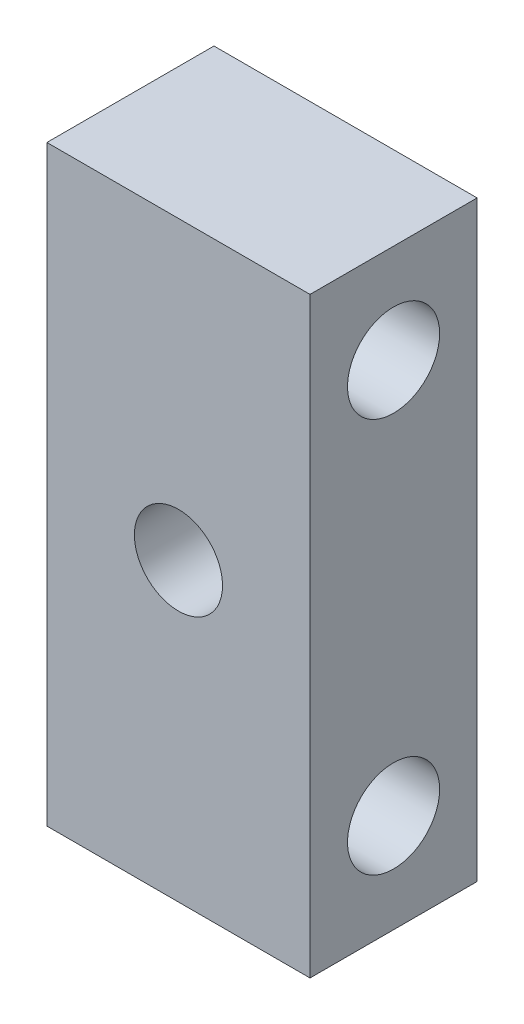
ISO-10303-21;
HEADER;
FILE_DESCRIPTION(('STEP AP214'),'2;1');
FILE_NAME('part.step','',(''),(''),'','','');
FILE_SCHEMA(('AUTOMOTIVE_DESIGN { 1 0 10303 214 1 1 1 1 }'));
ENDSEC;
DATA;
#1=APPLICATION_CONTEXT('core data for automotive mechanical design processes');
#2=APPLICATION_PROTOCOL_DEFINITION('international standard','automotive_design',2000,#1);
#3=PRODUCT_CONTEXT('',#1,'mechanical');
#4=PRODUCT('Part','Part','',(#3));
#5=PRODUCT_RELATED_PRODUCT_CATEGORY('part','',(#4));
#6=PRODUCT_DEFINITION_FORMATION('','',#4);
#7=PRODUCT_DEFINITION_CONTEXT('part definition',#1,'design');
#8=PRODUCT_DEFINITION('design','',#6,#7);
#9=PRODUCT_DEFINITION_SHAPE('','',#8);
#10=(LENGTH_UNIT() NAMED_UNIT(*) SI_UNIT(.MILLI.,.METRE.));
#11=(NAMED_UNIT(*) PLANE_ANGLE_UNIT() SI_UNIT($,.RADIAN.));
#12=(NAMED_UNIT(*) SI_UNIT($,.STERADIAN.) SOLID_ANGLE_UNIT());
#13=UNCERTAINTY_MEASURE_WITH_UNIT(LENGTH_MEASURE(1.E-05),#10,'distance_accuracy_value','');
#14=(GEOMETRIC_REPRESENTATION_CONTEXT(3) GLOBAL_UNCERTAINTY_ASSIGNED_CONTEXT((#13)) GLOBAL_UNIT_ASSIGNED_CONTEXT((#10,
#11,#12)) REPRESENTATION_CONTEXT('',''));
#15=CARTESIAN_POINT('',(0.,0.,0.));
#16=DIRECTION('',(0.,0.,1.));
#17=DIRECTION('',(1.,0.,0.));
#18=AXIS2_PLACEMENT_3D('',#15,#16,#17);
#19=CARTESIAN_POINT('',(-10.,22.5,12.7));
#20=DIRECTION('',(1.,0.,0.));
#21=DIRECTION('',(0.,0.,-1.));
#22=AXIS2_PLACEMENT_3D('',#19,#20,#21);
#23=PLANE('',#22);
#24=CARTESIAN_POINT('',(-10.,15.,6.35));
#25=DIRECTION('',(1.,0.,0.));
#26=DIRECTION('',(0.,0.,-1.));
#27=AXIS2_PLACEMENT_3D('',#24,#25,#26);
#28=CIRCLE('',#27,3.5);
#29=CARTESIAN_POINT('',(-10.,15.,2.85));
#30=VERTEX_POINT('',#29);
#31=EDGE_CURVE('E113',#30,#30,#28,.T.);
#32=ORIENTED_EDGE('',*,*,#31,.T.);
#33=EDGE_LOOP('',(#32));
#34=FACE_BOUND('',#33,.T.);
#35=CARTESIAN_POINT('',(-10.,-15.,6.35));
#36=DIRECTION('',(1.,0.,0.));
#37=DIRECTION('',(0.,0.,-1.));
#38=AXIS2_PLACEMENT_3D('',#35,#36,#37);
#39=CIRCLE('',#38,3.5);
#40=CARTESIAN_POINT('',(-10.,-15.,2.85));
#41=VERTEX_POINT('',#40);
#42=EDGE_CURVE('E119',#41,#41,#39,.T.);
#43=ORIENTED_EDGE('',*,*,#42,.T.);
#44=EDGE_LOOP('',(#43));
#45=FACE_BOUND('',#44,.T.);
#46=DIRECTION('',(0.,-1.,0.));
#47=VECTOR('',#46,1.);
#48=CARTESIAN_POINT('',(-10.,22.5,0.));
#49=LINE('',#48,#47);
#50=CARTESIAN_POINT('',(-10.,22.5,0.));
#51=VERTEX_POINT('',#50);
#52=CARTESIAN_POINT('',(-10.,-22.5,0.));
#53=VERTEX_POINT('',#52);
#54=EDGE_CURVE('E96',#51,#53,#49,.T.);
#55=ORIENTED_EDGE('',*,*,#54,.T.);
#56=DIRECTION('',(0.,0.,-1.));
#57=VECTOR('',#56,1.);
#58=CARTESIAN_POINT('',(-10.,-22.5,12.7));
#59=LINE('',#58,#57);
#60=CARTESIAN_POINT('',(-10.,-22.5,12.7));
#61=VERTEX_POINT('',#60);
#62=EDGE_CURVE('E11',#61,#53,#59,.T.);
#63=ORIENTED_EDGE('',*,*,#62,.F.);
#64=DIRECTION('',(0.,-1.,0.));
#65=VECTOR('',#64,1.);
#66=CARTESIAN_POINT('',(-10.,22.5,12.7));
#67=LINE('',#66,#65);
#68=CARTESIAN_POINT('',(-10.,22.5,12.7));
#69=VERTEX_POINT('',#68);
#70=EDGE_CURVE('E84',#69,#61,#67,.T.);
#71=ORIENTED_EDGE('',*,*,#70,.F.);
#72=DIRECTION('',(0.,0.,-1.));
#73=VECTOR('',#72,1.);
#74=CARTESIAN_POINT('',(-10.,22.5,12.7));
#75=LINE('',#74,#73);
#76=EDGE_CURVE('E92',#69,#51,#75,.T.);
#77=ORIENTED_EDGE('',*,*,#76,.T.);
#78=EDGE_LOOP('',(#55,#63,#71,#77));
#79=FACE_BOUND('',#78,.T.);
#80=ADVANCED_FACE('F33',(#34,#45,#79),#23,.F.);
#81=CARTESIAN_POINT('',(10.,-22.5,12.7));
#82=DIRECTION('',(0.,1.,0.));
#83=DIRECTION('',(-1.,0.,0.));
#84=AXIS2_PLACEMENT_3D('',#81,#82,#83);
#85=PLANE('',#84);
#86=DIRECTION('',(1.,0.,0.));
#87=VECTOR('',#86,1.);
#88=CARTESIAN_POINT('',(10.,-22.5,0.));
#89=LINE('',#88,#87);
#90=CARTESIAN_POINT('',(10.,-22.5,0.));
#91=VERTEX_POINT('',#90);
#92=EDGE_CURVE('E88',#53,#91,#89,.T.);
#93=ORIENTED_EDGE('',*,*,#92,.T.);
#94=DIRECTION('',(0.,0.,-1.));
#95=VECTOR('',#94,1.);
#96=CARTESIAN_POINT('',(10.,-22.5,12.7));
#97=LINE('',#96,#95);
#98=CARTESIAN_POINT('',(10.,-22.5,12.7));
#99=VERTEX_POINT('',#98);
#100=EDGE_CURVE('E41',#99,#91,#97,.T.);
#101=ORIENTED_EDGE('',*,*,#100,.F.);
#102=DIRECTION('',(1.,0.,0.));
#103=VECTOR('',#102,1.);
#104=CARTESIAN_POINT('',(10.,-22.5,12.7));
#105=LINE('',#104,#103);
#106=EDGE_CURVE('E79',#61,#99,#105,.T.);
#107=ORIENTED_EDGE('',*,*,#106,.F.);
#108=ORIENTED_EDGE('',*,*,#62,.T.);
#109=EDGE_LOOP('',(#93,#101,#107,#108));
#110=FACE_BOUND('',#109,.T.);
#111=ADVANCED_FACE('F87',(#110),#85,.F.);
#112=CARTESIAN_POINT('',(10.,22.5,12.7));
#113=DIRECTION('',(-1.,0.,0.));
#114=DIRECTION('',(0.,0.,1.));
#115=AXIS2_PLACEMENT_3D('',#112,#113,#114);
#116=PLANE('',#115);
#117=CARTESIAN_POINT('',(10.,15.,6.35));
#118=DIRECTION('',(1.,0.,0.));
#119=DIRECTION('',(0.,0.,-1.));
#120=AXIS2_PLACEMENT_3D('',#117,#118,#119);
#121=CIRCLE('',#120,3.5);
#122=CARTESIAN_POINT('',(10.,15.,2.85));
#123=VERTEX_POINT('',#122);
#124=EDGE_CURVE('E122',#123,#123,#121,.T.);
#125=ORIENTED_EDGE('',*,*,#124,.F.);
#126=EDGE_LOOP('',(#125));
#127=FACE_BOUND('',#126,.T.);
#128=CARTESIAN_POINT('',(10.,-15.,6.35));
#129=DIRECTION('',(1.,0.,0.));
#130=DIRECTION('',(0.,0.,-1.));
#131=AXIS2_PLACEMENT_3D('',#128,#129,#130);
#132=CIRCLE('',#131,3.5);
#133=CARTESIAN_POINT('',(10.,-15.,2.85));
#134=VERTEX_POINT('',#133);
#135=EDGE_CURVE('E116',#134,#134,#132,.T.);
#136=ORIENTED_EDGE('',*,*,#135,.F.);
#137=EDGE_LOOP('',(#136));
#138=FACE_BOUND('',#137,.T.);
#139=DIRECTION('',(0.,1.,0.));
#140=VECTOR('',#139,1.);
#141=CARTESIAN_POINT('',(10.,22.5,0.));
#142=LINE('',#141,#140);
#143=CARTESIAN_POINT('',(10.,22.5,0.));
#144=VERTEX_POINT('',#143);
#145=EDGE_CURVE('E66',#91,#144,#142,.T.);
#146=ORIENTED_EDGE('',*,*,#145,.T.);
#147=DIRECTION('',(0.,0.,-1.));
#148=VECTOR('',#147,1.);
#149=CARTESIAN_POINT('',(10.,22.5,12.7));
#150=LINE('',#149,#148);
#151=CARTESIAN_POINT('',(10.,22.5,12.7));
#152=VERTEX_POINT('',#151);
#153=EDGE_CURVE('E89',#152,#144,#150,.T.);
#154=ORIENTED_EDGE('',*,*,#153,.F.);
#155=DIRECTION('',(0.,1.,0.));
#156=VECTOR('',#155,1.);
#157=CARTESIAN_POINT('',(10.,22.5,12.7));
#158=LINE('',#157,#156);
#159=EDGE_CURVE('E82',#99,#152,#158,.T.);
#160=ORIENTED_EDGE('',*,*,#159,.F.);
#161=ORIENTED_EDGE('',*,*,#100,.T.);
#162=EDGE_LOOP('',(#146,#154,#160,#161));
#163=FACE_BOUND('',#162,.T.);
#164=ADVANCED_FACE('F90',(#127,#138,#163),#116,.F.);
#165=CARTESIAN_POINT('',(10.,22.5,12.7));
#166=DIRECTION('',(0.,-1.,0.));
#167=DIRECTION('',(0.,0.,-1.));
#168=AXIS2_PLACEMENT_3D('',#165,#166,#167);
#169=PLANE('',#168);
#170=DIRECTION('',(-1.,0.,0.));
#171=VECTOR('',#170,1.);
#172=CARTESIAN_POINT('',(10.,22.5,0.));
#173=LINE('',#172,#171);
#174=EDGE_CURVE('E72',#144,#51,#173,.T.);
#175=ORIENTED_EDGE('',*,*,#174,.T.);
#176=ORIENTED_EDGE('',*,*,#76,.F.);
#177=DIRECTION('',(-1.,0.,0.));
#178=VECTOR('',#177,1.);
#179=CARTESIAN_POINT('',(10.,22.5,12.7));
#180=LINE('',#179,#178);
#181=EDGE_CURVE('E49',#152,#69,#180,.T.);
#182=ORIENTED_EDGE('',*,*,#181,.F.);
#183=ORIENTED_EDGE('',*,*,#153,.T.);
#184=EDGE_LOOP('',(#175,#176,#182,#183));
#185=FACE_BOUND('',#184,.T.);
#186=ADVANCED_FACE('F104',(#185),#169,.F.);
#187=CARTESIAN_POINT('',(0.,0.,12.7));
#188=DIRECTION('',(0.,0.,-1.));
#189=DIRECTION('',(-1.,0.,0.));
#190=AXIS2_PLACEMENT_3D('',#187,#188,#189);
#191=PLANE('',#190);
#192=CARTESIAN_POINT('',(0.,0.,12.7));
#193=DIRECTION('',(0.,0.,1.));
#194=DIRECTION('',(1.,0.,0.));
#195=AXIS2_PLACEMENT_3D('',#192,#193,#194);
#196=CIRCLE('',#195,3.35);
#197=CARTESIAN_POINT('',(3.35,0.,12.7));
#198=VERTEX_POINT('',#197);
#199=EDGE_CURVE('E110',#198,#198,#196,.T.);
#200=ORIENTED_EDGE('',*,*,#199,.F.);
#201=EDGE_LOOP('',(#200));
#202=FACE_BOUND('',#201,.T.);
#203=ORIENTED_EDGE('',*,*,#70,.T.);
#204=ORIENTED_EDGE('',*,*,#106,.T.);
#205=ORIENTED_EDGE('',*,*,#159,.T.);
#206=ORIENTED_EDGE('',*,*,#181,.T.);
#207=EDGE_LOOP('',(#203,#204,#205,#206));
#208=FACE_BOUND('',#207,.T.);
#209=ADVANCED_FACE('F80',(#202,#208),#191,.F.);
#210=CARTESIAN_POINT('',(0.,0.,0.));
#211=DIRECTION('',(0.,0.,-1.));
#212=DIRECTION('',(-1.,0.,0.));
#213=AXIS2_PLACEMENT_3D('',#210,#211,#212);
#214=PLANE('',#213);
#215=CARTESIAN_POINT('',(0.,0.,0.));
#216=DIRECTION('',(0.,0.,1.));
#217=DIRECTION('',(1.,0.,0.));
#218=AXIS2_PLACEMENT_3D('',#215,#216,#217);
#219=CIRCLE('',#218,3.35);
#220=CARTESIAN_POINT('',(3.35,0.,0.));
#221=VERTEX_POINT('',#220);
#222=EDGE_CURVE('E99',#221,#221,#219,.T.);
#223=ORIENTED_EDGE('',*,*,#222,.T.);
#224=EDGE_LOOP('',(#223));
#225=FACE_BOUND('',#224,.T.);
#226=ORIENTED_EDGE('',*,*,#54,.F.);
#227=ORIENTED_EDGE('',*,*,#174,.F.);
#228=ORIENTED_EDGE('',*,*,#145,.F.);
#229=ORIENTED_EDGE('',*,*,#92,.F.);
#230=EDGE_LOOP('',(#226,#227,#228,#229));
#231=FACE_BOUND('',#230,.T.);
#232=ADVANCED_FACE('F107',(#225,#231),#214,.T.);
#233=CARTESIAN_POINT('',(0.,0.,0.));
#234=DIRECTION('',(0.,0.,1.));
#235=DIRECTION('',(1.,0.,0.));
#236=AXIS2_PLACEMENT_3D('',#233,#234,#235);
#237=CYLINDRICAL_SURFACE('',#236,3.35);
#238=ORIENTED_EDGE('',*,*,#222,.F.);
#239=EDGE_LOOP('',(#238));
#240=FACE_BOUND('',#239,.T.);
#241=ORIENTED_EDGE('',*,*,#199,.T.);
#242=EDGE_LOOP('',(#241));
#243=FACE_BOUND('',#242,.T.);
#244=ADVANCED_FACE('F143',(#240,#243),#237,.F.);
#245=CARTESIAN_POINT('',(-10.,-15.,6.35));
#246=DIRECTION('',(1.,0.,0.));
#247=DIRECTION('',(0.,0.,-1.));
#248=AXIS2_PLACEMENT_3D('',#245,#246,#247);
#249=CYLINDRICAL_SURFACE('',#248,3.5);
#250=ORIENTED_EDGE('',*,*,#42,.F.);
#251=EDGE_LOOP('',(#250));
#252=FACE_BOUND('',#251,.T.);
#253=ORIENTED_EDGE('',*,*,#135,.T.);
#254=EDGE_LOOP('',(#253));
#255=FACE_BOUND('',#254,.T.);
#256=ADVANCED_FACE('F133',(#252,#255),#249,.F.);
#257=CARTESIAN_POINT('',(-10.,15.,6.35));
#258=DIRECTION('',(1.,0.,0.));
#259=DIRECTION('',(0.,0.,-1.));
#260=AXIS2_PLACEMENT_3D('',#257,#258,#259);
#261=CYLINDRICAL_SURFACE('',#260,3.5);
#262=ORIENTED_EDGE('',*,*,#31,.F.);
#263=EDGE_LOOP('',(#262));
#264=FACE_BOUND('',#263,.T.);
#265=ORIENTED_EDGE('',*,*,#124,.T.);
#266=EDGE_LOOP('',(#265));
#267=FACE_BOUND('',#266,.T.);
#268=ADVANCED_FACE('F130',(#264,#267),#261,.F.);
#269=CLOSED_SHELL('',(#80,#111,#164,#186,#209,#232,#244,#256,#268));
#270=MANIFOLD_SOLID_BREP('B2',#269);
#271=ADVANCED_BREP_SHAPE_REPRESENTATION('',(#18,#270),#14);
#272=SHAPE_DEFINITION_REPRESENTATION(#9,#271);
ENDSEC;
END-ISO-10303-21;
